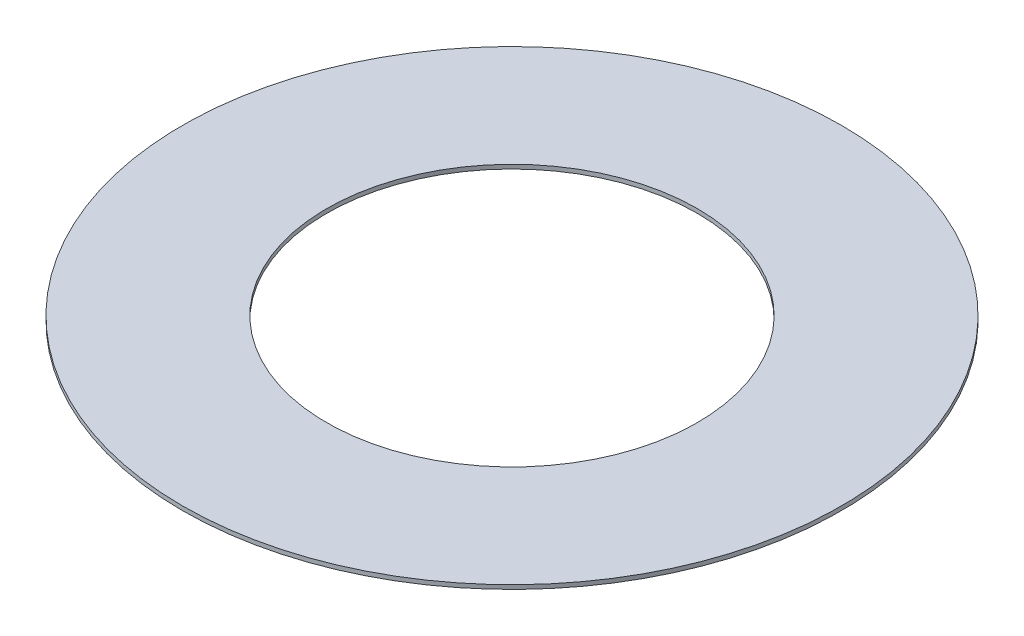
ISO-10303-21;
HEADER;
FILE_DESCRIPTION(('STEP AP214'),'2;1');
FILE_NAME('part.step','',(''),(''),'','','');
FILE_SCHEMA(('AUTOMOTIVE_DESIGN { 1 0 10303 214 1 1 1 1 }'));
ENDSEC;
DATA;
#1=APPLICATION_CONTEXT('core data for automotive mechanical design processes');
#2=APPLICATION_PROTOCOL_DEFINITION('international standard','automotive_design',2000,#1);
#3=PRODUCT_CONTEXT('',#1,'mechanical');
#4=PRODUCT('Part','Part','',(#3));
#5=PRODUCT_RELATED_PRODUCT_CATEGORY('part','',(#4));
#6=PRODUCT_DEFINITION_FORMATION('','',#4);
#7=PRODUCT_DEFINITION_CONTEXT('part definition',#1,'design');
#8=PRODUCT_DEFINITION('design','',#6,#7);
#9=PRODUCT_DEFINITION_SHAPE('','',#8);
#10=(LENGTH_UNIT() NAMED_UNIT(*) SI_UNIT(.MILLI.,.METRE.));
#11=(NAMED_UNIT(*) PLANE_ANGLE_UNIT() SI_UNIT($,.RADIAN.));
#12=(NAMED_UNIT(*) SI_UNIT($,.STERADIAN.) SOLID_ANGLE_UNIT());
#13=UNCERTAINTY_MEASURE_WITH_UNIT(LENGTH_MEASURE(1.E-05),#10,'distance_accuracy_value','');
#14=(GEOMETRIC_REPRESENTATION_CONTEXT(3) GLOBAL_UNCERTAINTY_ASSIGNED_CONTEXT((#13)) GLOBAL_UNIT_ASSIGNED_CONTEXT((#10,
#11,#12)) REPRESENTATION_CONTEXT('',''));
#15=CARTESIAN_POINT('',(0.,0.,0.));
#16=DIRECTION('',(0.,0.,1.));
#17=DIRECTION('',(1.,0.,0.));
#18=AXIS2_PLACEMENT_3D('',#15,#16,#17);
#19=CARTESIAN_POINT('',(24.2999994568527,1.51,6.59999985247851));
#20=DIRECTION('',(0.,-1.,0.));
#21=DIRECTION('',(0.,0.,-1.));
#22=AXIS2_PLACEMENT_3D('',#19,#20,#21);
#23=CYLINDRICAL_SURFACE('',#22,0.800000000000004);
#24=CARTESIAN_POINT('',(24.2999994568527,1.5,6.59999985247851));
#25=DIRECTION('',(0.,-1.,0.));
#26=DIRECTION('',(0.,0.,-1.));
#27=AXIS2_PLACEMENT_3D('',#24,#25,#26);
#28=CIRCLE('',#27,0.800000000000004);
#29=CARTESIAN_POINT('',(24.2999994568527,1.5,5.7999998524785));
#30=VERTEX_POINT('',#29);
#31=EDGE_CURVE('E27',#30,#30,#28,.T.);
#32=ORIENTED_EDGE('',*,*,#31,.F.);
#33=EDGE_LOOP('',(#32));
#34=FACE_BOUND('',#33,.T.);
#35=CARTESIAN_POINT('',(24.2999994568527,1.51,6.59999985247851));
#36=DIRECTION('',(0.,-1.,0.));
#37=DIRECTION('',(0.,0.,-1.));
#38=AXIS2_PLACEMENT_3D('',#35,#36,#37);
#39=CIRCLE('',#38,0.800000000000004);
#40=CARTESIAN_POINT('',(24.2999994568527,1.51,5.7999998524785));
#41=VERTEX_POINT('',#40);
#42=EDGE_CURVE('E18',#41,#41,#39,.F.);
#43=ORIENTED_EDGE('',*,*,#42,.F.);
#44=EDGE_LOOP('',(#43));
#45=FACE_BOUND('',#44,.T.);
#46=ADVANCED_FACE('F14',(#34,#45),#23,.T.);
#47=CARTESIAN_POINT('',(25.1099994568527,1.51,5.7899998524785));
#48=DIRECTION('',(0.,1.,0.));
#49=DIRECTION('',(-1.,0.,0.));
#50=AXIS2_PLACEMENT_3D('',#47,#48,#49);
#51=PLANE('',#50);
#52=CARTESIAN_POINT('',(24.2999994568527,1.51,6.59999985247851));
#53=DIRECTION('',(0.,-1.,0.));
#54=DIRECTION('',(0.,0.,-1.));
#55=AXIS2_PLACEMENT_3D('',#52,#53,#54);
#56=CIRCLE('',#55,0.449999999999994);
#57=CARTESIAN_POINT('',(24.2999994568527,1.51,6.14999985247851));
#58=VERTEX_POINT('',#57);
#59=EDGE_CURVE('E22',#58,#58,#56,.F.);
#60=ORIENTED_EDGE('',*,*,#59,.F.);
#61=EDGE_LOOP('',(#60));
#62=FACE_BOUND('',#61,.T.);
#63=ORIENTED_EDGE('',*,*,#42,.T.);
#64=EDGE_LOOP('',(#63));
#65=FACE_BOUND('',#64,.T.);
#66=ADVANCED_FACE('F35',(#62,#65),#51,.T.);
#67=CARTESIAN_POINT('',(23.4899994568527,1.5,5.7899998524785));
#68=DIRECTION('',(0.,-1.,0.));
#69=DIRECTION('',(1.,0.,0.));
#70=AXIS2_PLACEMENT_3D('',#67,#68,#69);
#71=PLANE('',#70);
#72=CARTESIAN_POINT('',(24.2999994568527,1.5,6.59999985247851));
#73=DIRECTION('',(0.,-1.,0.));
#74=DIRECTION('',(0.,0.,-1.));
#75=AXIS2_PLACEMENT_3D('',#72,#73,#74);
#76=CIRCLE('',#75,0.449999999999994);
#77=CARTESIAN_POINT('',(24.2999994568527,1.5,6.14999985247851));
#78=VERTEX_POINT('',#77);
#79=EDGE_CURVE('E10',#78,#78,#76,.T.);
#80=ORIENTED_EDGE('',*,*,#79,.F.);
#81=EDGE_LOOP('',(#80));
#82=FACE_BOUND('',#81,.T.);
#83=ORIENTED_EDGE('',*,*,#31,.T.);
#84=EDGE_LOOP('',(#83));
#85=FACE_BOUND('',#84,.T.);
#86=ADVANCED_FACE('F44',(#82,#85),#71,.T.);
#87=CARTESIAN_POINT('',(24.2999994568527,1.51,6.59999985247851));
#88=DIRECTION('',(0.,-1.,0.));
#89=DIRECTION('',(0.,0.,-1.));
#90=AXIS2_PLACEMENT_3D('',#87,#88,#89);
#91=CYLINDRICAL_SURFACE('',#90,0.449999999999994);
#92=ORIENTED_EDGE('',*,*,#79,.T.);
#93=EDGE_LOOP('',(#92));
#94=FACE_BOUND('',#93,.T.);
#95=ORIENTED_EDGE('',*,*,#59,.T.);
#96=EDGE_LOOP('',(#95));
#97=FACE_BOUND('',#96,.T.);
#98=ADVANCED_FACE('F16',(#94,#97),#91,.F.);
#99=CLOSED_SHELL('',(#46,#66,#86,#98));
#100=MANIFOLD_SOLID_BREP('B1',#99);
#101=ADVANCED_BREP_SHAPE_REPRESENTATION('',(#18,#100),#14);
#102=SHAPE_DEFINITION_REPRESENTATION(#9,#101);
ENDSEC;
END-ISO-10303-21;
